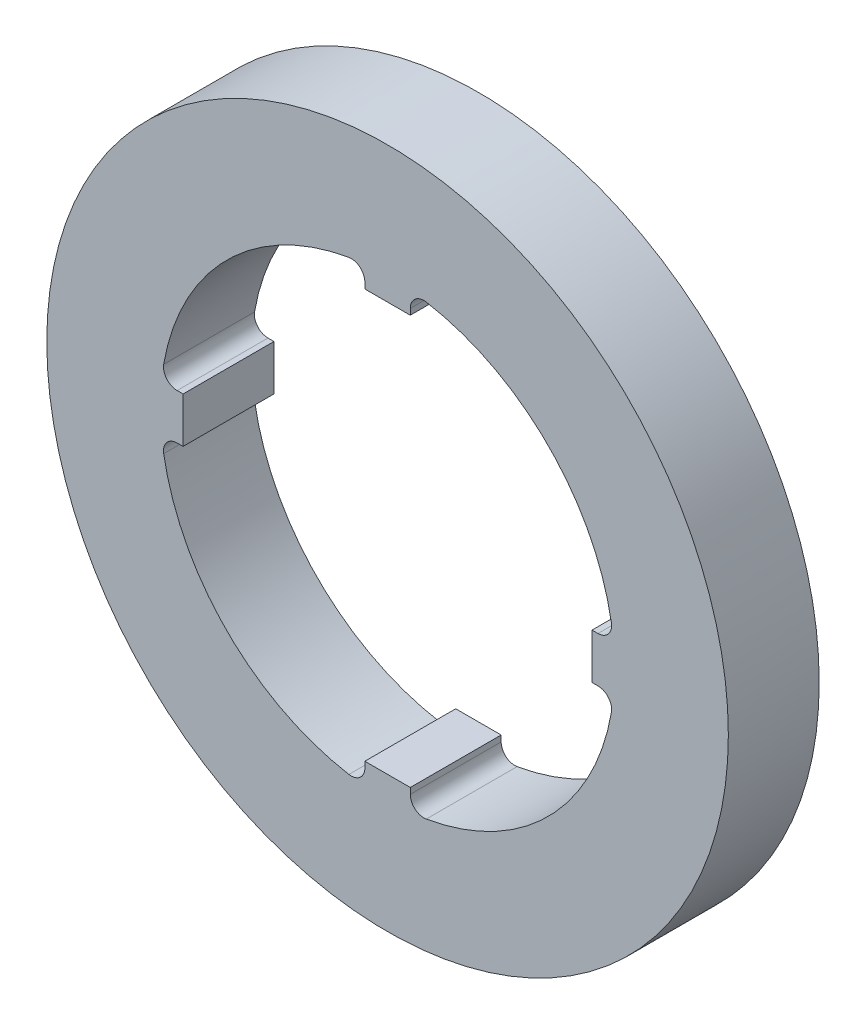
ISO-10303-21;
HEADER;
FILE_DESCRIPTION(('STEP AP214'),'2;1');
FILE_NAME('part.step','',(''),(''),'','','');
FILE_SCHEMA(('AUTOMOTIVE_DESIGN { 1 0 10303 214 1 1 1 1 }'));
ENDSEC;
DATA;
#1=APPLICATION_CONTEXT('core data for automotive mechanical design processes');
#2=APPLICATION_PROTOCOL_DEFINITION('international standard','automotive_design',2000,#1);
#3=PRODUCT_CONTEXT('',#1,'mechanical');
#4=PRODUCT('Part','Part','',(#3));
#5=PRODUCT_RELATED_PRODUCT_CATEGORY('part','',(#4));
#6=PRODUCT_DEFINITION_FORMATION('','',#4);
#7=PRODUCT_DEFINITION_CONTEXT('part definition',#1,'design');
#8=PRODUCT_DEFINITION('design','',#6,#7);
#9=PRODUCT_DEFINITION_SHAPE('','',#8);
#10=(LENGTH_UNIT() NAMED_UNIT(*) SI_UNIT(.MILLI.,.METRE.));
#11=(NAMED_UNIT(*) PLANE_ANGLE_UNIT() SI_UNIT($,.RADIAN.));
#12=(NAMED_UNIT(*) SI_UNIT($,.STERADIAN.) SOLID_ANGLE_UNIT());
#13=UNCERTAINTY_MEASURE_WITH_UNIT(LENGTH_MEASURE(1.E-05),#10,'distance_accuracy_value','');
#14=(GEOMETRIC_REPRESENTATION_CONTEXT(3) GLOBAL_UNCERTAINTY_ASSIGNED_CONTEXT((#13)) GLOBAL_UNIT_ASSIGNED_CONTEXT((#10,
#11,#12)) REPRESENTATION_CONTEXT('',''));
#15=CARTESIAN_POINT('',(0.,0.,0.));
#16=DIRECTION('',(0.,0.,1.));
#17=DIRECTION('',(1.,0.,0.));
#18=AXIS2_PLACEMENT_3D('',#15,#16,#17);
#19=CARTESIAN_POINT('',(0.,0.,10.));
#20=DIRECTION('',(0.,0.,1.));
#21=DIRECTION('',(1.,0.,0.));
#22=AXIS2_PLACEMENT_3D('',#19,#20,#21);
#23=PLANE('',#22);
#24=CARTESIAN_POINT('',(0.,0.,10.));
#25=DIRECTION('',(0.,0.,1.));
#26=DIRECTION('',(1.,0.,0.));
#27=AXIS2_PLACEMENT_3D('',#24,#25,#26);
#28=CIRCLE('',#27,75.);
#29=CARTESIAN_POINT('',(75.,0.,10.));
#30=VERTEX_POINT('',#29);
#31=EDGE_CURVE('E11',#30,#30,#28,.T.);
#32=ORIENTED_EDGE('',*,*,#31,.T.);
#33=EDGE_LOOP('',(#32));
#34=FACE_BOUND('',#33,.T.);
#35=DIRECTION('',(0.,-1.,0.));
#36=VECTOR('',#35,1.);
#37=CARTESIAN_POINT('',(5.,45.,10.));
#38=LINE('',#37,#36);
#39=CARTESIAN_POINT('',(5.,46.3141447076376,10.));
#40=VERTEX_POINT('',#39);
#41=CARTESIAN_POINT('',(5.,45.,10.));
#42=VERTEX_POINT('',#41);
#43=EDGE_CURVE('E202',#40,#42,#38,.T.);
#44=ORIENTED_EDGE('',*,*,#43,.F.);
#45=CARTESIAN_POINT('',(8.,46.3141447076376,10.));
#46=DIRECTION('',(0.,0.,1.));
#47=DIRECTION('',(-1.,0.,0.));
#48=AXIS2_PLACEMENT_3D('',#45,#46,#47);
#49=CIRCLE('',#48,3.);
#50=CARTESIAN_POINT('',(8.51063829787233,49.2703667102528,10.));
#51=VERTEX_POINT('',#50);
#52=EDGE_CURVE('E194',#51,#40,#49,.T.);
#53=ORIENTED_EDGE('',*,*,#52,.F.);
#54=CARTESIAN_POINT('',(0.,0.,10.));
#55=DIRECTION('',(0.,0.,1.));
#56=DIRECTION('',(1.,0.,0.));
#57=AXIS2_PLACEMENT_3D('',#54,#55,#56);
#58=CIRCLE('',#57,50.);
#59=CARTESIAN_POINT('',(49.2703667102528,8.51063829787234,10.));
#60=VERTEX_POINT('',#59);
#61=EDGE_CURVE('E258',#60,#51,#58,.T.);
#62=ORIENTED_EDGE('',*,*,#61,.F.);
#63=CARTESIAN_POINT('',(46.3141447076376,8.,10.));
#64=DIRECTION('',(0.,0.,1.));
#65=DIRECTION('',(1.,0.,0.));
#66=AXIS2_PLACEMENT_3D('',#63,#64,#65);
#67=CIRCLE('',#66,3.);
#68=CARTESIAN_POINT('',(46.3141447076376,5.,10.));
#69=VERTEX_POINT('',#68);
#70=EDGE_CURVE('E256',#69,#60,#67,.T.);
#71=ORIENTED_EDGE('',*,*,#70,.F.);
#72=DIRECTION('',(1.,0.,0.));
#73=VECTOR('',#72,1.);
#74=CARTESIAN_POINT('',(46.3141447076376,5.,10.));
#75=LINE('',#74,#73);
#76=CARTESIAN_POINT('',(45.,5.,10.));
#77=VERTEX_POINT('',#76);
#78=EDGE_CURVE('E254',#77,#69,#75,.T.);
#79=ORIENTED_EDGE('',*,*,#78,.F.);
#80=DIRECTION('',(0.,1.,0.));
#81=VECTOR('',#80,1.);
#82=CARTESIAN_POINT('',(45.,5.,10.));
#83=LINE('',#82,#81);
#84=CARTESIAN_POINT('',(45.,-5.,10.));
#85=VERTEX_POINT('',#84);
#86=EDGE_CURVE('E252',#85,#77,#83,.T.);
#87=ORIENTED_EDGE('',*,*,#86,.F.);
#88=DIRECTION('',(-1.,0.,0.));
#89=VECTOR('',#88,1.);
#90=CARTESIAN_POINT('',(45.,-5.,10.));
#91=LINE('',#90,#89);
#92=CARTESIAN_POINT('',(46.3141447076376,-5.,10.));
#93=VERTEX_POINT('',#92);
#94=EDGE_CURVE('E250',#93,#85,#91,.T.);
#95=ORIENTED_EDGE('',*,*,#94,.F.);
#96=CARTESIAN_POINT('',(46.3141447076376,-8.,10.));
#97=DIRECTION('',(0.,0.,1.));
#98=DIRECTION('',(-1.,0.,0.));
#99=AXIS2_PLACEMENT_3D('',#96,#97,#98);
#100=CIRCLE('',#99,3.);
#101=CARTESIAN_POINT('',(49.2703667102528,-8.51063829787233,10.));
#102=VERTEX_POINT('',#101);
#103=EDGE_CURVE('E248',#102,#93,#100,.T.);
#104=ORIENTED_EDGE('',*,*,#103,.F.);
#105=CARTESIAN_POINT('',(0.,0.,10.));
#106=DIRECTION('',(0.,0.,1.));
#107=DIRECTION('',(1.,0.,0.));
#108=AXIS2_PLACEMENT_3D('',#105,#106,#107);
#109=CIRCLE('',#108,50.);
#110=CARTESIAN_POINT('',(8.51063829787234,-49.2703667102528,10.));
#111=VERTEX_POINT('',#110);
#112=EDGE_CURVE('E246',#111,#102,#109,.T.);
#113=ORIENTED_EDGE('',*,*,#112,.F.);
#114=CARTESIAN_POINT('',(8.,-46.3141447076376,10.));
#115=DIRECTION('',(0.,0.,1.));
#116=DIRECTION('',(1.,0.,0.));
#117=AXIS2_PLACEMENT_3D('',#114,#115,#116);
#118=CIRCLE('',#117,3.);
#119=CARTESIAN_POINT('',(5.,-46.3141447076376,10.));
#120=VERTEX_POINT('',#119);
#121=EDGE_CURVE('E244',#120,#111,#118,.T.);
#122=ORIENTED_EDGE('',*,*,#121,.F.);
#123=DIRECTION('',(0.,-1.,0.));
#124=VECTOR('',#123,1.);
#125=CARTESIAN_POINT('',(5.,-45.,10.));
#126=LINE('',#125,#124);
#127=CARTESIAN_POINT('',(5.,-45.,10.));
#128=VERTEX_POINT('',#127);
#129=EDGE_CURVE('E242',#128,#120,#126,.T.);
#130=ORIENTED_EDGE('',*,*,#129,.F.);
#131=DIRECTION('',(1.,0.,0.));
#132=VECTOR('',#131,1.);
#133=CARTESIAN_POINT('',(-5.,-45.,10.));
#134=LINE('',#133,#132);
#135=CARTESIAN_POINT('',(-5.,-45.,10.));
#136=VERTEX_POINT('',#135);
#137=EDGE_CURVE('E240',#136,#128,#134,.T.);
#138=ORIENTED_EDGE('',*,*,#137,.F.);
#139=DIRECTION('',(0.,1.,0.));
#140=VECTOR('',#139,1.);
#141=CARTESIAN_POINT('',(-5.,-46.3141447076376,10.));
#142=LINE('',#141,#140);
#143=CARTESIAN_POINT('',(-5.,-46.3141447076376,10.));
#144=VERTEX_POINT('',#143);
#145=EDGE_CURVE('E238',#144,#136,#142,.T.);
#146=ORIENTED_EDGE('',*,*,#145,.F.);
#147=CARTESIAN_POINT('',(-8.,-46.3141447076376,10.));
#148=DIRECTION('',(0.,0.,1.));
#149=DIRECTION('',(-1.,0.,0.));
#150=AXIS2_PLACEMENT_3D('',#147,#148,#149);
#151=CIRCLE('',#150,3.);
#152=CARTESIAN_POINT('',(-8.51063829787237,-49.2703667102528,10.));
#153=VERTEX_POINT('',#152);
#154=EDGE_CURVE('E236',#153,#144,#151,.T.);
#155=ORIENTED_EDGE('',*,*,#154,.F.);
#156=CARTESIAN_POINT('',(0.,0.,10.));
#157=DIRECTION('',(0.,0.,1.));
#158=DIRECTION('',(1.,0.,0.));
#159=AXIS2_PLACEMENT_3D('',#156,#157,#158);
#160=CIRCLE('',#159,50.);
#161=CARTESIAN_POINT('',(-49.2703667102528,-8.51063829787234,10.));
#162=VERTEX_POINT('',#161);
#163=EDGE_CURVE('E234',#162,#153,#160,.T.);
#164=ORIENTED_EDGE('',*,*,#163,.F.);
#165=CARTESIAN_POINT('',(-46.3141447076376,-8.,10.));
#166=DIRECTION('',(0.,0.,1.));
#167=DIRECTION('',(1.,0.,0.));
#168=AXIS2_PLACEMENT_3D('',#165,#166,#167);
#169=CIRCLE('',#168,3.);
#170=CARTESIAN_POINT('',(-46.3141447076376,-5.,10.));
#171=VERTEX_POINT('',#170);
#172=EDGE_CURVE('E232',#171,#162,#169,.T.);
#173=ORIENTED_EDGE('',*,*,#172,.F.);
#174=DIRECTION('',(-1.,0.,0.));
#175=VECTOR('',#174,1.);
#176=CARTESIAN_POINT('',(-45.,-5.,10.));
#177=LINE('',#176,#175);
#178=CARTESIAN_POINT('',(-45.,-5.,10.));
#179=VERTEX_POINT('',#178);
#180=EDGE_CURVE('E230',#179,#171,#177,.T.);
#181=ORIENTED_EDGE('',*,*,#180,.F.);
#182=DIRECTION('',(0.,-1.,0.));
#183=VECTOR('',#182,1.);
#184=CARTESIAN_POINT('',(-45.,5.,10.));
#185=LINE('',#184,#183);
#186=CARTESIAN_POINT('',(-45.,5.,10.));
#187=VERTEX_POINT('',#186);
#188=EDGE_CURVE('E228',#187,#179,#185,.T.);
#189=ORIENTED_EDGE('',*,*,#188,.F.);
#190=DIRECTION('',(1.,0.,0.));
#191=VECTOR('',#190,1.);
#192=CARTESIAN_POINT('',(-46.3141447076376,5.,10.));
#193=LINE('',#192,#191);
#194=CARTESIAN_POINT('',(-46.3141447076376,5.,10.));
#195=VERTEX_POINT('',#194);
#196=EDGE_CURVE('E226',#195,#187,#193,.T.);
#197=ORIENTED_EDGE('',*,*,#196,.F.);
#198=CARTESIAN_POINT('',(-46.3141447076376,8.,10.));
#199=DIRECTION('',(0.,0.,1.));
#200=DIRECTION('',(-1.,0.,0.));
#201=AXIS2_PLACEMENT_3D('',#198,#199,#200);
#202=CIRCLE('',#201,3.);
#203=CARTESIAN_POINT('',(-49.2703667102528,8.51063829787235,10.));
#204=VERTEX_POINT('',#203);
#205=EDGE_CURVE('E224',#204,#195,#202,.T.);
#206=ORIENTED_EDGE('',*,*,#205,.F.);
#207=CARTESIAN_POINT('',(0.,0.,10.));
#208=DIRECTION('',(0.,0.,1.));
#209=DIRECTION('',(1.,0.,0.));
#210=AXIS2_PLACEMENT_3D('',#207,#208,#209);
#211=CIRCLE('',#210,50.);
#212=CARTESIAN_POINT('',(-8.51063829787234,49.2703667102528,10.));
#213=VERTEX_POINT('',#212);
#214=EDGE_CURVE('E222',#213,#204,#211,.T.);
#215=ORIENTED_EDGE('',*,*,#214,.F.);
#216=CARTESIAN_POINT('',(-8.,46.3141447076376,10.));
#217=DIRECTION('',(0.,0.,1.));
#218=DIRECTION('',(1.,0.,0.));
#219=AXIS2_PLACEMENT_3D('',#216,#217,#218);
#220=CIRCLE('',#219,3.);
#221=CARTESIAN_POINT('',(-5.,46.3141447076376,10.));
#222=VERTEX_POINT('',#221);
#223=EDGE_CURVE('E220',#222,#213,#220,.T.);
#224=ORIENTED_EDGE('',*,*,#223,.F.);
#225=DIRECTION('',(0.,1.,0.));
#226=VECTOR('',#225,1.);
#227=CARTESIAN_POINT('',(-5.,46.3141447076376,10.));
#228=LINE('',#227,#226);
#229=CARTESIAN_POINT('',(-5.,45.,10.));
#230=VERTEX_POINT('',#229);
#231=EDGE_CURVE('E216',#230,#222,#228,.T.);
#232=ORIENTED_EDGE('',*,*,#231,.F.);
#233=DIRECTION('',(-1.,0.,0.));
#234=VECTOR('',#233,1.);
#235=CARTESIAN_POINT('',(-5.,45.,10.));
#236=LINE('',#235,#234);
#237=EDGE_CURVE('E214',#42,#230,#236,.T.);
#238=ORIENTED_EDGE('',*,*,#237,.F.);
#239=EDGE_LOOP('',(#44,#53,#62,#71,#79,#87,#95,#104,#113,#122,#130,#138,#146,#155,#164,#173,
#181,#189,#197,#206,#215,#224,#232,#238));
#240=FACE_BOUND('',#239,.T.);
#241=ADVANCED_FACE('F33',(#34,#240),#23,.T.);
#242=CARTESIAN_POINT('',(0.,0.,-10.));
#243=DIRECTION('',(0.,0.,1.));
#244=DIRECTION('',(1.,0.,0.));
#245=AXIS2_PLACEMENT_3D('',#242,#243,#244);
#246=PLANE('',#245);
#247=CARTESIAN_POINT('',(0.,0.,-10.));
#248=DIRECTION('',(0.,0.,1.));
#249=DIRECTION('',(1.,0.,0.));
#250=AXIS2_PLACEMENT_3D('',#247,#248,#249);
#251=CIRCLE('',#250,75.);
#252=CARTESIAN_POINT('',(75.,0.,-10.));
#253=VERTEX_POINT('',#252);
#254=EDGE_CURVE('E37',#253,#253,#251,.T.);
#255=ORIENTED_EDGE('',*,*,#254,.F.);
#256=EDGE_LOOP('',(#255));
#257=FACE_BOUND('',#256,.T.);
#258=CARTESIAN_POINT('',(8.,46.3141447076376,-10.));
#259=DIRECTION('',(0.,0.,1.));
#260=DIRECTION('',(-1.,0.,0.));
#261=AXIS2_PLACEMENT_3D('',#258,#259,#260);
#262=CIRCLE('',#261,3.);
#263=CARTESIAN_POINT('',(8.51063829787233,49.2703667102528,-10.));
#264=VERTEX_POINT('',#263);
#265=CARTESIAN_POINT('',(5.,46.3141447076376,-10.));
#266=VERTEX_POINT('',#265);
#267=EDGE_CURVE('E56',#264,#266,#262,.T.);
#268=ORIENTED_EDGE('',*,*,#267,.T.);
#269=DIRECTION('',(0.,-1.,0.));
#270=VECTOR('',#269,1.);
#271=CARTESIAN_POINT('',(5.,45.,-10.));
#272=LINE('',#271,#270);
#273=CARTESIAN_POINT('',(5.,45.,-10.));
#274=VERTEX_POINT('',#273);
#275=EDGE_CURVE('E209',#266,#274,#272,.T.);
#276=ORIENTED_EDGE('',*,*,#275,.T.);
#277=DIRECTION('',(-1.,0.,0.));
#278=VECTOR('',#277,1.);
#279=CARTESIAN_POINT('',(-5.,45.,-10.));
#280=LINE('',#279,#278);
#281=CARTESIAN_POINT('',(-5.,45.,-10.));
#282=VERTEX_POINT('',#281);
#283=EDGE_CURVE('E262',#274,#282,#280,.T.);
#284=ORIENTED_EDGE('',*,*,#283,.T.);
#285=DIRECTION('',(0.,1.,0.));
#286=VECTOR('',#285,1.);
#287=CARTESIAN_POINT('',(-5.,46.3141447076376,-10.));
#288=LINE('',#287,#286);
#289=CARTESIAN_POINT('',(-5.,46.3141447076376,-10.));
#290=VERTEX_POINT('',#289);
#291=EDGE_CURVE('E265',#282,#290,#288,.T.);
#292=ORIENTED_EDGE('',*,*,#291,.T.);
#293=CARTESIAN_POINT('',(-8.,46.3141447076376,-10.));
#294=DIRECTION('',(0.,0.,1.));
#295=DIRECTION('',(1.,0.,0.));
#296=AXIS2_PLACEMENT_3D('',#293,#294,#295);
#297=CIRCLE('',#296,3.);
#298=CARTESIAN_POINT('',(-8.51063829787234,49.2703667102528,-10.));
#299=VERTEX_POINT('',#298);
#300=EDGE_CURVE('E268',#290,#299,#297,.T.);
#301=ORIENTED_EDGE('',*,*,#300,.T.);
#302=CARTESIAN_POINT('',(0.,0.,-10.));
#303=DIRECTION('',(0.,0.,1.));
#304=DIRECTION('',(1.,0.,0.));
#305=AXIS2_PLACEMENT_3D('',#302,#303,#304);
#306=CIRCLE('',#305,50.);
#307=CARTESIAN_POINT('',(-49.2703667102528,8.51063829787235,-10.));
#308=VERTEX_POINT('',#307);
#309=EDGE_CURVE('E271',#299,#308,#306,.T.);
#310=ORIENTED_EDGE('',*,*,#309,.T.);
#311=CARTESIAN_POINT('',(-46.3141447076376,8.,-10.));
#312=DIRECTION('',(0.,0.,1.));
#313=DIRECTION('',(-1.,0.,0.));
#314=AXIS2_PLACEMENT_3D('',#311,#312,#313);
#315=CIRCLE('',#314,3.);
#316=CARTESIAN_POINT('',(-46.3141447076376,5.,-10.));
#317=VERTEX_POINT('',#316);
#318=EDGE_CURVE('E274',#308,#317,#315,.T.);
#319=ORIENTED_EDGE('',*,*,#318,.T.);
#320=DIRECTION('',(1.,0.,0.));
#321=VECTOR('',#320,1.);
#322=CARTESIAN_POINT('',(-46.3141447076376,5.,-10.));
#323=LINE('',#322,#321);
#324=CARTESIAN_POINT('',(-45.,5.,-10.));
#325=VERTEX_POINT('',#324);
#326=EDGE_CURVE('E277',#317,#325,#323,.T.);
#327=ORIENTED_EDGE('',*,*,#326,.T.);
#328=DIRECTION('',(0.,-1.,0.));
#329=VECTOR('',#328,1.);
#330=CARTESIAN_POINT('',(-45.,5.,-10.));
#331=LINE('',#330,#329);
#332=CARTESIAN_POINT('',(-45.,-5.,-10.));
#333=VERTEX_POINT('',#332);
#334=EDGE_CURVE('E280',#325,#333,#331,.T.);
#335=ORIENTED_EDGE('',*,*,#334,.T.);
#336=DIRECTION('',(-1.,0.,0.));
#337=VECTOR('',#336,1.);
#338=CARTESIAN_POINT('',(-45.,-5.,-10.));
#339=LINE('',#338,#337);
#340=CARTESIAN_POINT('',(-46.3141447076376,-5.,-10.));
#341=VERTEX_POINT('',#340);
#342=EDGE_CURVE('E283',#333,#341,#339,.T.);
#343=ORIENTED_EDGE('',*,*,#342,.T.);
#344=CARTESIAN_POINT('',(-46.3141447076376,-8.,-10.));
#345=DIRECTION('',(0.,0.,1.));
#346=DIRECTION('',(1.,0.,0.));
#347=AXIS2_PLACEMENT_3D('',#344,#345,#346);
#348=CIRCLE('',#347,3.);
#349=CARTESIAN_POINT('',(-49.2703667102528,-8.51063829787234,-10.));
#350=VERTEX_POINT('',#349);
#351=EDGE_CURVE('E286',#341,#350,#348,.T.);
#352=ORIENTED_EDGE('',*,*,#351,.T.);
#353=CARTESIAN_POINT('',(0.,0.,-10.));
#354=DIRECTION('',(0.,0.,1.));
#355=DIRECTION('',(1.,0.,0.));
#356=AXIS2_PLACEMENT_3D('',#353,#354,#355);
#357=CIRCLE('',#356,50.);
#358=CARTESIAN_POINT('',(-8.51063829787237,-49.2703667102528,-10.));
#359=VERTEX_POINT('',#358);
#360=EDGE_CURVE('E289',#350,#359,#357,.T.);
#361=ORIENTED_EDGE('',*,*,#360,.T.);
#362=CARTESIAN_POINT('',(-8.,-46.3141447076376,-10.));
#363=DIRECTION('',(0.,0.,1.));
#364=DIRECTION('',(-1.,0.,0.));
#365=AXIS2_PLACEMENT_3D('',#362,#363,#364);
#366=CIRCLE('',#365,3.);
#367=CARTESIAN_POINT('',(-5.,-46.3141447076376,-10.));
#368=VERTEX_POINT('',#367);
#369=EDGE_CURVE('E292',#359,#368,#366,.T.);
#370=ORIENTED_EDGE('',*,*,#369,.T.);
#371=DIRECTION('',(0.,1.,0.));
#372=VECTOR('',#371,1.);
#373=CARTESIAN_POINT('',(-5.,-46.3141447076376,-10.));
#374=LINE('',#373,#372);
#375=CARTESIAN_POINT('',(-5.,-45.,-10.));
#376=VERTEX_POINT('',#375);
#377=EDGE_CURVE('E295',#368,#376,#374,.T.);
#378=ORIENTED_EDGE('',*,*,#377,.T.);
#379=DIRECTION('',(1.,0.,0.));
#380=VECTOR('',#379,1.);
#381=CARTESIAN_POINT('',(-5.,-45.,-10.));
#382=LINE('',#381,#380);
#383=CARTESIAN_POINT('',(5.,-45.,-10.));
#384=VERTEX_POINT('',#383);
#385=EDGE_CURVE('E298',#376,#384,#382,.T.);
#386=ORIENTED_EDGE('',*,*,#385,.T.);
#387=DIRECTION('',(0.,-1.,0.));
#388=VECTOR('',#387,1.);
#389=CARTESIAN_POINT('',(5.,-45.,-10.));
#390=LINE('',#389,#388);
#391=CARTESIAN_POINT('',(5.,-46.3141447076376,-10.));
#392=VERTEX_POINT('',#391);
#393=EDGE_CURVE('E301',#384,#392,#390,.T.);
#394=ORIENTED_EDGE('',*,*,#393,.T.);
#395=CARTESIAN_POINT('',(8.,-46.3141447076376,-10.));
#396=DIRECTION('',(0.,0.,1.));
#397=DIRECTION('',(1.,0.,0.));
#398=AXIS2_PLACEMENT_3D('',#395,#396,#397);
#399=CIRCLE('',#398,3.);
#400=CARTESIAN_POINT('',(8.51063829787234,-49.2703667102528,-10.));
#401=VERTEX_POINT('',#400);
#402=EDGE_CURVE('E304',#392,#401,#399,.T.);
#403=ORIENTED_EDGE('',*,*,#402,.T.);
#404=CARTESIAN_POINT('',(0.,0.,-10.));
#405=DIRECTION('',(0.,0.,1.));
#406=DIRECTION('',(1.,0.,0.));
#407=AXIS2_PLACEMENT_3D('',#404,#405,#406);
#408=CIRCLE('',#407,50.);
#409=CARTESIAN_POINT('',(49.2703667102528,-8.51063829787233,-10.));
#410=VERTEX_POINT('',#409);
#411=EDGE_CURVE('E307',#401,#410,#408,.T.);
#412=ORIENTED_EDGE('',*,*,#411,.T.);
#413=CARTESIAN_POINT('',(46.3141447076376,-8.,-10.));
#414=DIRECTION('',(0.,0.,1.));
#415=DIRECTION('',(-1.,0.,0.));
#416=AXIS2_PLACEMENT_3D('',#413,#414,#415);
#417=CIRCLE('',#416,3.);
#418=CARTESIAN_POINT('',(46.3141447076376,-5.,-10.));
#419=VERTEX_POINT('',#418);
#420=EDGE_CURVE('E310',#410,#419,#417,.T.);
#421=ORIENTED_EDGE('',*,*,#420,.T.);
#422=DIRECTION('',(-1.,0.,0.));
#423=VECTOR('',#422,1.);
#424=CARTESIAN_POINT('',(45.,-5.,-10.));
#425=LINE('',#424,#423);
#426=CARTESIAN_POINT('',(45.,-5.,-10.));
#427=VERTEX_POINT('',#426);
#428=EDGE_CURVE('E313',#419,#427,#425,.T.);
#429=ORIENTED_EDGE('',*,*,#428,.T.);
#430=DIRECTION('',(0.,1.,0.));
#431=VECTOR('',#430,1.);
#432=CARTESIAN_POINT('',(45.,5.,-10.));
#433=LINE('',#432,#431);
#434=CARTESIAN_POINT('',(45.,5.,-10.));
#435=VERTEX_POINT('',#434);
#436=EDGE_CURVE('E316',#427,#435,#433,.T.);
#437=ORIENTED_EDGE('',*,*,#436,.T.);
#438=DIRECTION('',(1.,0.,0.));
#439=VECTOR('',#438,1.);
#440=CARTESIAN_POINT('',(46.3141447076376,5.,-10.));
#441=LINE('',#440,#439);
#442=CARTESIAN_POINT('',(46.3141447076376,5.,-10.));
#443=VERTEX_POINT('',#442);
#444=EDGE_CURVE('E319',#435,#443,#441,.T.);
#445=ORIENTED_EDGE('',*,*,#444,.T.);
#446=CARTESIAN_POINT('',(46.3141447076376,8.,-10.));
#447=DIRECTION('',(0.,0.,1.));
#448=DIRECTION('',(1.,0.,0.));
#449=AXIS2_PLACEMENT_3D('',#446,#447,#448);
#450=CIRCLE('',#449,3.);
#451=CARTESIAN_POINT('',(49.2703667102528,8.51063829787234,-10.));
#452=VERTEX_POINT('',#451);
#453=EDGE_CURVE('E322',#443,#452,#450,.T.);
#454=ORIENTED_EDGE('',*,*,#453,.T.);
#455=CARTESIAN_POINT('',(0.,0.,-10.));
#456=DIRECTION('',(0.,0.,1.));
#457=DIRECTION('',(1.,0.,0.));
#458=AXIS2_PLACEMENT_3D('',#455,#456,#457);
#459=CIRCLE('',#458,50.);
#460=EDGE_CURVE('E203',#452,#264,#459,.T.);
#461=ORIENTED_EDGE('',*,*,#460,.T.);
#462=EDGE_LOOP('',(#268,#276,#284,#292,#301,#310,#319,#327,#335,#343,#352,#361,#370,#378,#386,
#394,#403,#412,#421,#429,#437,#445,#454,#461));
#463=FACE_BOUND('',#462,.T.);
#464=ADVANCED_FACE('F375',(#257,#463),#246,.F.);
#465=CARTESIAN_POINT('',(0.,0.,10.));
#466=DIRECTION('',(0.,0.,-1.));
#467=DIRECTION('',(-1.,0.,0.));
#468=AXIS2_PLACEMENT_3D('',#465,#466,#467);
#469=CYLINDRICAL_SURFACE('',#468,75.);
#470=ORIENTED_EDGE('',*,*,#31,.F.);
#471=EDGE_LOOP('',(#470));
#472=FACE_BOUND('',#471,.T.);
#473=ORIENTED_EDGE('',*,*,#254,.T.);
#474=EDGE_LOOP('',(#473));
#475=FACE_BOUND('',#474,.T.);
#476=ADVANCED_FACE('F35',(#472,#475),#469,.T.);
#477=CARTESIAN_POINT('',(8.,46.3141447076376,10.));
#478=DIRECTION('',(0.,0.,-1.));
#479=DIRECTION('',(-1.,0.,0.));
#480=AXIS2_PLACEMENT_3D('',#477,#478,#479);
#481=CYLINDRICAL_SURFACE('',#480,3.);
#482=ORIENTED_EDGE('',*,*,#267,.F.);
#483=DIRECTION('',(0.,0.,-1.));
#484=VECTOR('',#483,1.);
#485=CARTESIAN_POINT('',(8.51063829787233,49.2703667102528,10.));
#486=LINE('',#485,#484);
#487=EDGE_CURVE('E198',#51,#264,#486,.T.);
#488=ORIENTED_EDGE('',*,*,#487,.F.);
#489=ORIENTED_EDGE('',*,*,#52,.T.);
#490=DIRECTION('',(0.,0.,-1.));
#491=VECTOR('',#490,1.);
#492=CARTESIAN_POINT('',(5.,46.3141447076376,10.));
#493=LINE('',#492,#491);
#494=EDGE_CURVE('E197',#40,#266,#493,.T.);
#495=ORIENTED_EDGE('',*,*,#494,.T.);
#496=EDGE_LOOP('',(#482,#488,#489,#495));
#497=FACE_BOUND('',#496,.T.);
#498=ADVANCED_FACE('F196',(#497),#481,.F.);
#499=CARTESIAN_POINT('',(5.,45.,10.));
#500=DIRECTION('',(1.,0.,0.));
#501=DIRECTION('',(0.,1.,0.));
#502=AXIS2_PLACEMENT_3D('',#499,#500,#501);
#503=PLANE('',#502);
#504=ORIENTED_EDGE('',*,*,#275,.F.);
#505=ORIENTED_EDGE('',*,*,#494,.F.);
#506=ORIENTED_EDGE('',*,*,#43,.T.);
#507=DIRECTION('',(0.,0.,-1.));
#508=VECTOR('',#507,1.);
#509=CARTESIAN_POINT('',(5.,45.,10.));
#510=LINE('',#509,#508);
#511=EDGE_CURVE('E210',#42,#274,#510,.T.);
#512=ORIENTED_EDGE('',*,*,#511,.T.);
#513=EDGE_LOOP('',(#504,#505,#506,#512));
#514=FACE_BOUND('',#513,.T.);
#515=ADVANCED_FACE('F206',(#514),#503,.T.);
#516=CARTESIAN_POINT('',(-5.,45.,10.));
#517=DIRECTION('',(0.,-1.,0.));
#518=DIRECTION('',(0.,0.,-1.));
#519=AXIS2_PLACEMENT_3D('',#516,#517,#518);
#520=PLANE('',#519);
#521=ORIENTED_EDGE('',*,*,#283,.F.);
#522=ORIENTED_EDGE('',*,*,#511,.F.);
#523=ORIENTED_EDGE('',*,*,#237,.T.);
#524=DIRECTION('',(0.,0.,-1.));
#525=VECTOR('',#524,1.);
#526=CARTESIAN_POINT('',(-5.,45.,10.));
#527=LINE('',#526,#525);
#528=EDGE_CURVE('E367',#230,#282,#527,.T.);
#529=ORIENTED_EDGE('',*,*,#528,.T.);
#530=EDGE_LOOP('',(#521,#522,#523,#529));
#531=FACE_BOUND('',#530,.T.);
#532=ADVANCED_FACE('F371',(#531),#520,.T.);
#533=CARTESIAN_POINT('',(-5.,46.3141447076376,10.));
#534=DIRECTION('',(-1.,0.,0.));
#535=DIRECTION('',(0.,0.,1.));
#536=AXIS2_PLACEMENT_3D('',#533,#534,#535);
#537=PLANE('',#536);
#538=ORIENTED_EDGE('',*,*,#291,.F.);
#539=ORIENTED_EDGE('',*,*,#528,.F.);
#540=ORIENTED_EDGE('',*,*,#231,.T.);
#541=DIRECTION('',(0.,0.,-1.));
#542=VECTOR('',#541,1.);
#543=CARTESIAN_POINT('',(-5.,46.3141447076376,10.));
#544=LINE('',#543,#542);
#545=EDGE_CURVE('E365',#222,#290,#544,.T.);
#546=ORIENTED_EDGE('',*,*,#545,.T.);
#547=EDGE_LOOP('',(#538,#539,#540,#546));
#548=FACE_BOUND('',#547,.T.);
#549=ADVANCED_FACE('F473',(#548),#537,.T.);
#550=CARTESIAN_POINT('',(-8.,46.3141447076376,10.));
#551=DIRECTION('',(0.,0.,-1.));
#552=DIRECTION('',(-1.,0.,0.));
#553=AXIS2_PLACEMENT_3D('',#550,#551,#552);
#554=CYLINDRICAL_SURFACE('',#553,3.);
#555=ORIENTED_EDGE('',*,*,#300,.F.);
#556=ORIENTED_EDGE('',*,*,#545,.F.);
#557=ORIENTED_EDGE('',*,*,#223,.T.);
#558=DIRECTION('',(0.,0.,-1.));
#559=VECTOR('',#558,1.);
#560=CARTESIAN_POINT('',(-8.51063829787234,49.2703667102528,10.));
#561=LINE('',#560,#559);
#562=EDGE_CURVE('E363',#213,#299,#561,.T.);
#563=ORIENTED_EDGE('',*,*,#562,.T.);
#564=EDGE_LOOP('',(#555,#556,#557,#563));
#565=FACE_BOUND('',#564,.T.);
#566=ADVANCED_FACE('F471',(#565),#554,.F.);
#567=CARTESIAN_POINT('',(0.,0.,10.));
#568=DIRECTION('',(0.,0.,-1.));
#569=DIRECTION('',(-1.,0.,0.));
#570=AXIS2_PLACEMENT_3D('',#567,#568,#569);
#571=CYLINDRICAL_SURFACE('',#570,50.);
#572=ORIENTED_EDGE('',*,*,#309,.F.);
#573=ORIENTED_EDGE('',*,*,#562,.F.);
#574=ORIENTED_EDGE('',*,*,#214,.T.);
#575=DIRECTION('',(0.,0.,-1.));
#576=VECTOR('',#575,1.);
#577=CARTESIAN_POINT('',(-49.2703667102528,8.51063829787235,10.));
#578=LINE('',#577,#576);
#579=EDGE_CURVE('E361',#204,#308,#578,.T.);
#580=ORIENTED_EDGE('',*,*,#579,.T.);
#581=EDGE_LOOP('',(#572,#573,#574,#580));
#582=FACE_BOUND('',#581,.T.);
#583=ADVANCED_FACE('F465',(#582),#571,.F.);
#584=CARTESIAN_POINT('',(-46.3141447076376,8.,10.));
#585=DIRECTION('',(0.,0.,-1.));
#586=DIRECTION('',(-1.,0.,0.));
#587=AXIS2_PLACEMENT_3D('',#584,#585,#586);
#588=CYLINDRICAL_SURFACE('',#587,3.);
#589=ORIENTED_EDGE('',*,*,#318,.F.);
#590=ORIENTED_EDGE('',*,*,#579,.F.);
#591=ORIENTED_EDGE('',*,*,#205,.T.);
#592=DIRECTION('',(0.,0.,-1.));
#593=VECTOR('',#592,1.);
#594=CARTESIAN_POINT('',(-46.3141447076376,5.,10.));
#595=LINE('',#594,#593);
#596=EDGE_CURVE('E359',#195,#317,#595,.T.);
#597=ORIENTED_EDGE('',*,*,#596,.T.);
#598=EDGE_LOOP('',(#589,#590,#591,#597));
#599=FACE_BOUND('',#598,.T.);
#600=ADVANCED_FACE('F461',(#599),#588,.F.);
#601=CARTESIAN_POINT('',(-46.3141447076376,5.,10.));
#602=DIRECTION('',(0.,1.,0.));
#603=DIRECTION('',(0.,0.,1.));
#604=AXIS2_PLACEMENT_3D('',#601,#602,#603);
#605=PLANE('',#604);
#606=ORIENTED_EDGE('',*,*,#326,.F.);
#607=ORIENTED_EDGE('',*,*,#596,.F.);
#608=ORIENTED_EDGE('',*,*,#196,.T.);
#609=DIRECTION('',(0.,0.,-1.));
#610=VECTOR('',#609,1.);
#611=CARTESIAN_POINT('',(-45.,5.,10.));
#612=LINE('',#611,#610);
#613=EDGE_CURVE('E357',#187,#325,#612,.T.);
#614=ORIENTED_EDGE('',*,*,#613,.T.);
#615=EDGE_LOOP('',(#606,#607,#608,#614));
#616=FACE_BOUND('',#615,.T.);
#617=ADVANCED_FACE('F458',(#616),#605,.T.);
#618=CARTESIAN_POINT('',(-45.,5.,10.));
#619=DIRECTION('',(1.,0.,0.));
#620=DIRECTION('',(0.,0.,-1.));
#621=AXIS2_PLACEMENT_3D('',#618,#619,#620);
#622=PLANE('',#621);
#623=ORIENTED_EDGE('',*,*,#334,.F.);
#624=ORIENTED_EDGE('',*,*,#613,.F.);
#625=ORIENTED_EDGE('',*,*,#188,.T.);
#626=DIRECTION('',(0.,0.,-1.));
#627=VECTOR('',#626,1.);
#628=CARTESIAN_POINT('',(-45.,-5.,10.));
#629=LINE('',#628,#627);
#630=EDGE_CURVE('E355',#179,#333,#629,.T.);
#631=ORIENTED_EDGE('',*,*,#630,.T.);
#632=EDGE_LOOP('',(#623,#624,#625,#631));
#633=FACE_BOUND('',#632,.T.);
#634=ADVANCED_FACE('F450',(#633),#622,.T.);
#635=CARTESIAN_POINT('',(-45.,-5.,10.));
#636=DIRECTION('',(0.,-1.,0.));
#637=DIRECTION('',(0.,0.,-1.));
#638=AXIS2_PLACEMENT_3D('',#635,#636,#637);
#639=PLANE('',#638);
#640=ORIENTED_EDGE('',*,*,#342,.F.);
#641=ORIENTED_EDGE('',*,*,#630,.F.);
#642=ORIENTED_EDGE('',*,*,#180,.T.);
#643=DIRECTION('',(0.,0.,-1.));
#644=VECTOR('',#643,1.);
#645=CARTESIAN_POINT('',(-46.3141447076376,-5.,10.));
#646=LINE('',#645,#644);
#647=EDGE_CURVE('E353',#171,#341,#646,.T.);
#648=ORIENTED_EDGE('',*,*,#647,.T.);
#649=EDGE_LOOP('',(#640,#641,#642,#648));
#650=FACE_BOUND('',#649,.T.);
#651=ADVANCED_FACE('F446',(#650),#639,.T.);
#652=CARTESIAN_POINT('',(-46.3141447076376,-8.,10.));
#653=DIRECTION('',(0.,0.,-1.));
#654=DIRECTION('',(-1.,0.,0.));
#655=AXIS2_PLACEMENT_3D('',#652,#653,#654);
#656=CYLINDRICAL_SURFACE('',#655,3.);
#657=ORIENTED_EDGE('',*,*,#351,.F.);
#658=ORIENTED_EDGE('',*,*,#647,.F.);
#659=ORIENTED_EDGE('',*,*,#172,.T.);
#660=DIRECTION('',(0.,0.,-1.));
#661=VECTOR('',#660,1.);
#662=CARTESIAN_POINT('',(-49.2703667102528,-8.51063829787234,10.));
#663=LINE('',#662,#661);
#664=EDGE_CURVE('E351',#162,#350,#663,.T.);
#665=ORIENTED_EDGE('',*,*,#664,.T.);
#666=EDGE_LOOP('',(#657,#658,#659,#665));
#667=FACE_BOUND('',#666,.T.);
#668=ADVANCED_FACE('F443',(#667),#656,.F.);
#669=CARTESIAN_POINT('',(0.,0.,10.));
#670=DIRECTION('',(0.,0.,-1.));
#671=DIRECTION('',(-1.,0.,0.));
#672=AXIS2_PLACEMENT_3D('',#669,#670,#671);
#673=CYLINDRICAL_SURFACE('',#672,50.);
#674=ORIENTED_EDGE('',*,*,#360,.F.);
#675=ORIENTED_EDGE('',*,*,#664,.F.);
#676=ORIENTED_EDGE('',*,*,#163,.T.);
#677=DIRECTION('',(0.,0.,-1.));
#678=VECTOR('',#677,1.);
#679=CARTESIAN_POINT('',(-8.51063829787237,-49.2703667102528,10.));
#680=LINE('',#679,#678);
#681=EDGE_CURVE('E349',#153,#359,#680,.T.);
#682=ORIENTED_EDGE('',*,*,#681,.T.);
#683=EDGE_LOOP('',(#674,#675,#676,#682));
#684=FACE_BOUND('',#683,.T.);
#685=ADVANCED_FACE('F435',(#684),#673,.F.);
#686=CARTESIAN_POINT('',(-8.,-46.3141447076376,10.));
#687=DIRECTION('',(0.,0.,-1.));
#688=DIRECTION('',(-1.,0.,0.));
#689=AXIS2_PLACEMENT_3D('',#686,#687,#688);
#690=CYLINDRICAL_SURFACE('',#689,3.);
#691=ORIENTED_EDGE('',*,*,#369,.F.);
#692=ORIENTED_EDGE('',*,*,#681,.F.);
#693=ORIENTED_EDGE('',*,*,#154,.T.);
#694=DIRECTION('',(0.,0.,-1.));
#695=VECTOR('',#694,1.);
#696=CARTESIAN_POINT('',(-5.,-46.3141447076376,10.));
#697=LINE('',#696,#695);
#698=EDGE_CURVE('E347',#144,#368,#697,.T.);
#699=ORIENTED_EDGE('',*,*,#698,.T.);
#700=EDGE_LOOP('',(#691,#692,#693,#699));
#701=FACE_BOUND('',#700,.T.);
#702=ADVANCED_FACE('F431',(#701),#690,.F.);
#703=CARTESIAN_POINT('',(-5.,-46.3141447076376,10.));
#704=DIRECTION('',(-1.,0.,0.));
#705=DIRECTION('',(0.,0.,1.));
#706=AXIS2_PLACEMENT_3D('',#703,#704,#705);
#707=PLANE('',#706);
#708=ORIENTED_EDGE('',*,*,#377,.F.);
#709=ORIENTED_EDGE('',*,*,#698,.F.);
#710=ORIENTED_EDGE('',*,*,#145,.T.);
#711=DIRECTION('',(0.,0.,-1.));
#712=VECTOR('',#711,1.);
#713=CARTESIAN_POINT('',(-5.,-45.,10.));
#714=LINE('',#713,#712);
#715=EDGE_CURVE('E345',#136,#376,#714,.T.);
#716=ORIENTED_EDGE('',*,*,#715,.T.);
#717=EDGE_LOOP('',(#708,#709,#710,#716));
#718=FACE_BOUND('',#717,.T.);
#719=ADVANCED_FACE('F428',(#718),#707,.T.);
#720=CARTESIAN_POINT('',(-5.,-45.,10.));
#721=DIRECTION('',(0.,1.,0.));
#722=DIRECTION('',(0.,0.,1.));
#723=AXIS2_PLACEMENT_3D('',#720,#721,#722);
#724=PLANE('',#723);
#725=ORIENTED_EDGE('',*,*,#385,.F.);
#726=ORIENTED_EDGE('',*,*,#715,.F.);
#727=ORIENTED_EDGE('',*,*,#137,.T.);
#728=DIRECTION('',(0.,0.,-1.));
#729=VECTOR('',#728,1.);
#730=CARTESIAN_POINT('',(5.,-45.,10.));
#731=LINE('',#730,#729);
#732=EDGE_CURVE('E343',#128,#384,#731,.T.);
#733=ORIENTED_EDGE('',*,*,#732,.T.);
#734=EDGE_LOOP('',(#725,#726,#727,#733));
#735=FACE_BOUND('',#734,.T.);
#736=ADVANCED_FACE('F420',(#735),#724,.T.);
#737=CARTESIAN_POINT('',(5.,-45.,10.));
#738=DIRECTION('',(1.,0.,0.));
#739=DIRECTION('',(0.,1.,0.));
#740=AXIS2_PLACEMENT_3D('',#737,#738,#739);
#741=PLANE('',#740);
#742=ORIENTED_EDGE('',*,*,#393,.F.);
#743=ORIENTED_EDGE('',*,*,#732,.F.);
#744=ORIENTED_EDGE('',*,*,#129,.T.);
#745=DIRECTION('',(0.,0.,-1.));
#746=VECTOR('',#745,1.);
#747=CARTESIAN_POINT('',(5.,-46.3141447076376,10.));
#748=LINE('',#747,#746);
#749=EDGE_CURVE('E341',#120,#392,#748,.T.);
#750=ORIENTED_EDGE('',*,*,#749,.T.);
#751=EDGE_LOOP('',(#742,#743,#744,#750));
#752=FACE_BOUND('',#751,.T.);
#753=ADVANCED_FACE('F416',(#752),#741,.T.);
#754=CARTESIAN_POINT('',(8.,-46.3141447076376,10.));
#755=DIRECTION('',(0.,0.,-1.));
#756=DIRECTION('',(-1.,0.,0.));
#757=AXIS2_PLACEMENT_3D('',#754,#755,#756);
#758=CYLINDRICAL_SURFACE('',#757,3.);
#759=ORIENTED_EDGE('',*,*,#402,.F.);
#760=ORIENTED_EDGE('',*,*,#749,.F.);
#761=ORIENTED_EDGE('',*,*,#121,.T.);
#762=DIRECTION('',(0.,0.,-1.));
#763=VECTOR('',#762,1.);
#764=CARTESIAN_POINT('',(8.51063829787234,-49.2703667102528,10.));
#765=LINE('',#764,#763);
#766=EDGE_CURVE('E339',#111,#401,#765,.T.);
#767=ORIENTED_EDGE('',*,*,#766,.T.);
#768=EDGE_LOOP('',(#759,#760,#761,#767));
#769=FACE_BOUND('',#768,.T.);
#770=ADVANCED_FACE('F413',(#769),#758,.F.);
#771=CARTESIAN_POINT('',(0.,0.,10.));
#772=DIRECTION('',(0.,0.,-1.));
#773=DIRECTION('',(-1.,0.,0.));
#774=AXIS2_PLACEMENT_3D('',#771,#772,#773);
#775=CYLINDRICAL_SURFACE('',#774,50.);
#776=ORIENTED_EDGE('',*,*,#411,.F.);
#777=ORIENTED_EDGE('',*,*,#766,.F.);
#778=ORIENTED_EDGE('',*,*,#112,.T.);
#779=DIRECTION('',(0.,0.,-1.));
#780=VECTOR('',#779,1.);
#781=CARTESIAN_POINT('',(49.2703667102528,-8.51063829787233,10.));
#782=LINE('',#781,#780);
#783=EDGE_CURVE('E337',#102,#410,#782,.T.);
#784=ORIENTED_EDGE('',*,*,#783,.T.);
#785=EDGE_LOOP('',(#776,#777,#778,#784));
#786=FACE_BOUND('',#785,.T.);
#787=ADVANCED_FACE('F405',(#786),#775,.F.);
#788=CARTESIAN_POINT('',(46.3141447076376,-8.,10.));
#789=DIRECTION('',(0.,0.,-1.));
#790=DIRECTION('',(-1.,0.,0.));
#791=AXIS2_PLACEMENT_3D('',#788,#789,#790);
#792=CYLINDRICAL_SURFACE('',#791,3.);
#793=ORIENTED_EDGE('',*,*,#420,.F.);
#794=ORIENTED_EDGE('',*,*,#783,.F.);
#795=ORIENTED_EDGE('',*,*,#103,.T.);
#796=DIRECTION('',(0.,0.,-1.));
#797=VECTOR('',#796,1.);
#798=CARTESIAN_POINT('',(46.3141447076376,-5.,10.));
#799=LINE('',#798,#797);
#800=EDGE_CURVE('E335',#93,#419,#799,.T.);
#801=ORIENTED_EDGE('',*,*,#800,.T.);
#802=EDGE_LOOP('',(#793,#794,#795,#801));
#803=FACE_BOUND('',#802,.T.);
#804=ADVANCED_FACE('F401',(#803),#792,.F.);
#805=CARTESIAN_POINT('',(45.,-5.,10.));
#806=DIRECTION('',(0.,-1.,0.));
#807=DIRECTION('',(0.,0.,-1.));
#808=AXIS2_PLACEMENT_3D('',#805,#806,#807);
#809=PLANE('',#808);
#810=ORIENTED_EDGE('',*,*,#428,.F.);
#811=ORIENTED_EDGE('',*,*,#800,.F.);
#812=ORIENTED_EDGE('',*,*,#94,.T.);
#813=DIRECTION('',(0.,0.,-1.));
#814=VECTOR('',#813,1.);
#815=CARTESIAN_POINT('',(45.,-5.,10.));
#816=LINE('',#815,#814);
#817=EDGE_CURVE('E333',#85,#427,#816,.T.);
#818=ORIENTED_EDGE('',*,*,#817,.T.);
#819=EDGE_LOOP('',(#810,#811,#812,#818));
#820=FACE_BOUND('',#819,.T.);
#821=ADVANCED_FACE('F398',(#820),#809,.T.);
#822=CARTESIAN_POINT('',(45.,5.,10.));
#823=DIRECTION('',(-1.,0.,0.));
#824=DIRECTION('',(0.,0.,1.));
#825=AXIS2_PLACEMENT_3D('',#822,#823,#824);
#826=PLANE('',#825);
#827=ORIENTED_EDGE('',*,*,#436,.F.);
#828=ORIENTED_EDGE('',*,*,#817,.F.);
#829=ORIENTED_EDGE('',*,*,#86,.T.);
#830=DIRECTION('',(0.,0.,-1.));
#831=VECTOR('',#830,1.);
#832=CARTESIAN_POINT('',(45.,5.,10.));
#833=LINE('',#832,#831);
#834=EDGE_CURVE('E331',#77,#435,#833,.T.);
#835=ORIENTED_EDGE('',*,*,#834,.T.);
#836=EDGE_LOOP('',(#827,#828,#829,#835));
#837=FACE_BOUND('',#836,.T.);
#838=ADVANCED_FACE('F390',(#837),#826,.T.);
#839=CARTESIAN_POINT('',(46.3141447076376,5.,10.));
#840=DIRECTION('',(0.,1.,0.));
#841=DIRECTION('',(0.,0.,1.));
#842=AXIS2_PLACEMENT_3D('',#839,#840,#841);
#843=PLANE('',#842);
#844=ORIENTED_EDGE('',*,*,#444,.F.);
#845=ORIENTED_EDGE('',*,*,#834,.F.);
#846=ORIENTED_EDGE('',*,*,#78,.T.);
#847=DIRECTION('',(0.,0.,-1.));
#848=VECTOR('',#847,1.);
#849=CARTESIAN_POINT('',(46.3141447076376,5.,10.));
#850=LINE('',#849,#848);
#851=EDGE_CURVE('E329',#69,#443,#850,.T.);
#852=ORIENTED_EDGE('',*,*,#851,.T.);
#853=EDGE_LOOP('',(#844,#845,#846,#852));
#854=FACE_BOUND('',#853,.T.);
#855=ADVANCED_FACE('F386',(#854),#843,.T.);
#856=CARTESIAN_POINT('',(46.3141447076376,8.,10.));
#857=DIRECTION('',(0.,0.,-1.));
#858=DIRECTION('',(-1.,0.,0.));
#859=AXIS2_PLACEMENT_3D('',#856,#857,#858);
#860=CYLINDRICAL_SURFACE('',#859,3.);
#861=ORIENTED_EDGE('',*,*,#453,.F.);
#862=ORIENTED_EDGE('',*,*,#851,.F.);
#863=ORIENTED_EDGE('',*,*,#70,.T.);
#864=DIRECTION('',(0.,0.,-1.));
#865=VECTOR('',#864,1.);
#866=CARTESIAN_POINT('',(49.2703667102528,8.51063829787234,10.));
#867=LINE('',#866,#865);
#868=EDGE_CURVE('E48',#60,#452,#867,.T.);
#869=ORIENTED_EDGE('',*,*,#868,.T.);
#870=EDGE_LOOP('',(#861,#862,#863,#869));
#871=FACE_BOUND('',#870,.T.);
#872=ADVANCED_FACE('F383',(#871),#860,.F.);
#873=CARTESIAN_POINT('',(0.,0.,10.));
#874=DIRECTION('',(0.,0.,-1.));
#875=DIRECTION('',(-1.,0.,0.));
#876=AXIS2_PLACEMENT_3D('',#873,#874,#875);
#877=CYLINDRICAL_SURFACE('',#876,50.);
#878=ORIENTED_EDGE('',*,*,#460,.F.);
#879=ORIENTED_EDGE('',*,*,#868,.F.);
#880=ORIENTED_EDGE('',*,*,#61,.T.);
#881=ORIENTED_EDGE('',*,*,#487,.T.);
#882=EDGE_LOOP('',(#878,#879,#880,#881));
#883=FACE_BOUND('',#882,.T.);
#884=ADVANCED_FACE('F377',(#883),#877,.F.);
#885=CLOSED_SHELL('',(#241,#464,#476,#498,#515,#532,#549,#566,#583,#600,#617,#634,#651,#668,
#685,#702,#719,#736,#753,#770,#787,#804,#821,#838,#855,#872,#884));
#886=MANIFOLD_SOLID_BREP('B2',#885);
#887=ADVANCED_BREP_SHAPE_REPRESENTATION('',(#18,#886),#14);
#888=SHAPE_DEFINITION_REPRESENTATION(#9,#887);
ENDSEC;
END-ISO-10303-21;
